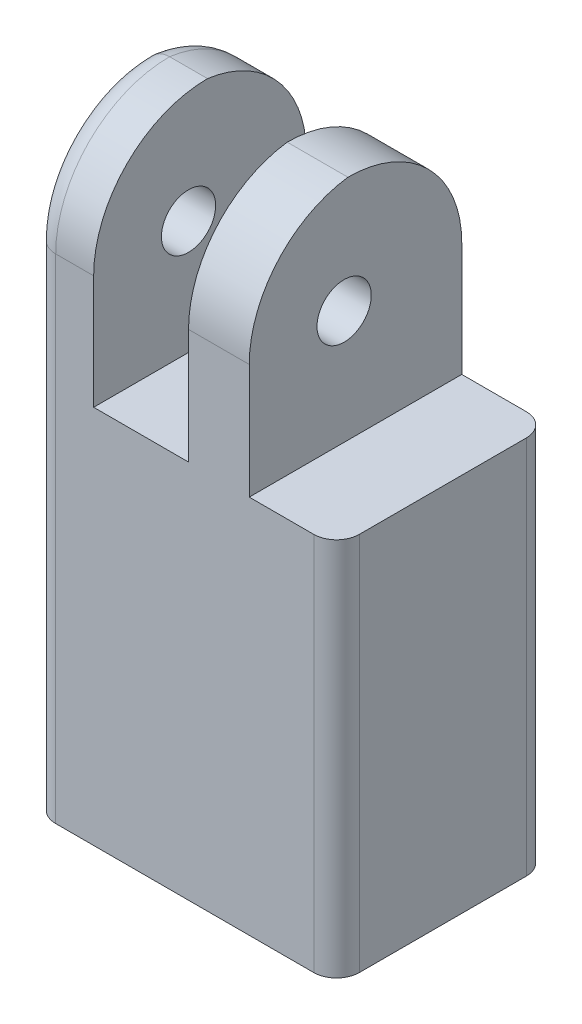
ISO-10303-21;
HEADER;
FILE_DESCRIPTION(('STEP AP214'),'2;1');
FILE_NAME('part.step','',(''),(''),'','','');
FILE_SCHEMA(('AUTOMOTIVE_DESIGN { 1 0 10303 214 1 1 1 1 }'));
ENDSEC;
DATA;
#1=APPLICATION_CONTEXT('core data for automotive mechanical design processes');
#2=APPLICATION_PROTOCOL_DEFINITION('international standard','automotive_design',2000,#1);
#3=PRODUCT_CONTEXT('',#1,'mechanical');
#4=PRODUCT('Part','Part','',(#3));
#5=PRODUCT_RELATED_PRODUCT_CATEGORY('part','',(#4));
#6=PRODUCT_DEFINITION_FORMATION('','',#4);
#7=PRODUCT_DEFINITION_CONTEXT('part definition',#1,'design');
#8=PRODUCT_DEFINITION('design','',#6,#7);
#9=PRODUCT_DEFINITION_SHAPE('','',#8);
#10=(LENGTH_UNIT() NAMED_UNIT(*) SI_UNIT(.MILLI.,.METRE.));
#11=(NAMED_UNIT(*) PLANE_ANGLE_UNIT() SI_UNIT($,.RADIAN.));
#12=(NAMED_UNIT(*) SI_UNIT($,.STERADIAN.) SOLID_ANGLE_UNIT());
#13=UNCERTAINTY_MEASURE_WITH_UNIT(LENGTH_MEASURE(1.E-05),#10,'distance_accuracy_value','');
#14=(GEOMETRIC_REPRESENTATION_CONTEXT(3) GLOBAL_UNCERTAINTY_ASSIGNED_CONTEXT((#13)) GLOBAL_UNIT_ASSIGNED_CONTEXT((#10,
#11,#12)) REPRESENTATION_CONTEXT('',''));
#15=CARTESIAN_POINT('',(0.,0.,0.));
#16=DIRECTION('',(0.,0.,1.));
#17=DIRECTION('',(1.,0.,0.));
#18=AXIS2_PLACEMENT_3D('',#15,#16,#17);
#19=CARTESIAN_POINT('',(0.,50.,0.));
#20=DIRECTION('',(0.,-1.,0.));
#21=DIRECTION('',(0.,0.,-1.));
#22=AXIS2_PLACEMENT_3D('',#19,#20,#21);
#23=PLANE('',#22);
#24=DIRECTION('',(0.,0.,1.));
#25=VECTOR('',#24,1.);
#26=CARTESIAN_POINT('',(20.5,50.,-28.));
#27=LINE('',#26,#25);
#28=CARTESIAN_POINT('',(20.5,50.,-28.));
#29=VERTEX_POINT('',#28);
#30=CARTESIAN_POINT('',(20.5,50.,0.));
#31=VERTEX_POINT('',#30);
#32=EDGE_CURVE('E160',#29,#31,#27,.T.);
#33=ORIENTED_EDGE('',*,*,#32,.F.);
#34=DIRECTION('',(-1.,0.,0.));
#35=VECTOR('',#34,1.);
#36=CARTESIAN_POINT('',(0.,50.,-28.));
#37=LINE('',#36,#35);
#38=CARTESIAN_POINT('',(7.99999999999999,50.,-28.));
#39=VERTEX_POINT('',#38);
#40=EDGE_CURVE('E169',#29,#39,#37,.T.);
#41=ORIENTED_EDGE('',*,*,#40,.T.);
#42=DIRECTION('',(0.,0.,-1.));
#43=VECTOR('',#42,1.);
#44=CARTESIAN_POINT('',(7.99999999999999,50.,-28.));
#45=LINE('',#44,#43);
#46=CARTESIAN_POINT('',(7.99999999999999,50.,0.));
#47=VERTEX_POINT('',#46);
#48=EDGE_CURVE('E198',#47,#39,#45,.T.);
#49=ORIENTED_EDGE('',*,*,#48,.F.);
#50=DIRECTION('',(1.,0.,0.));
#51=VECTOR('',#50,1.);
#52=CARTESIAN_POINT('',(0.,50.,0.));
#53=LINE('',#52,#51);
#54=EDGE_CURVE('E182',#47,#31,#53,.T.);
#55=ORIENTED_EDGE('',*,*,#54,.T.);
#56=EDGE_LOOP('',(#33,#41,#49,#55));
#57=FACE_BOUND('',#56,.T.);
#58=ADVANCED_FACE('F37',(#57),#23,.F.);
#59=DIRECTION('',(0.,0.,-1.));
#60=VECTOR('',#59,1.);
#61=CARTESIAN_POINT('',(40.,50.,0.));
#62=LINE('',#61,#60);
#63=CARTESIAN_POINT('',(40.,50.,-3.));
#64=VERTEX_POINT('',#63);
#65=CARTESIAN_POINT('',(40.,50.,-25.));
#66=VERTEX_POINT('',#65);
#67=EDGE_CURVE('E178',#64,#66,#62,.T.);
#68=ORIENTED_EDGE('',*,*,#67,.T.);
#69=CARTESIAN_POINT('',(37.,50.,-25.));
#70=DIRECTION('',(0.,-1.,0.));
#71=DIRECTION('',(0.,0.,-1.));
#72=AXIS2_PLACEMENT_3D('',#69,#70,#71);
#73=CIRCLE('',#72,3.);
#74=CARTESIAN_POINT('',(37.,50.,-28.));
#75=VERTEX_POINT('',#74);
#76=EDGE_CURVE('E45',#66,#75,#73,.F.);
#77=ORIENTED_EDGE('',*,*,#76,.T.);
#78=CARTESIAN_POINT('',(28.5,50.,-28.));
#79=VERTEX_POINT('',#78);
#80=EDGE_CURVE('E177',#75,#79,#37,.T.);
#81=ORIENTED_EDGE('',*,*,#80,.T.);
#82=DIRECTION('',(0.,0.,-1.));
#83=VECTOR('',#82,1.);
#84=CARTESIAN_POINT('',(28.5,50.,-28.));
#85=LINE('',#84,#83);
#86=CARTESIAN_POINT('',(28.5,50.,0.));
#87=VERTEX_POINT('',#86);
#88=EDGE_CURVE('E166',#87,#79,#85,.T.);
#89=ORIENTED_EDGE('',*,*,#88,.F.);
#90=CARTESIAN_POINT('',(37.,50.,0.));
#91=VERTEX_POINT('',#90);
#92=EDGE_CURVE('E205',#87,#91,#53,.T.);
#93=ORIENTED_EDGE('',*,*,#92,.T.);
#94=CARTESIAN_POINT('',(37.,50.,-3.));
#95=DIRECTION('',(0.,-1.,0.));
#96=DIRECTION('',(0.,0.,-1.));
#97=AXIS2_PLACEMENT_3D('',#94,#95,#96);
#98=CIRCLE('',#97,3.);
#99=EDGE_CURVE('E380',#91,#64,#98,.F.);
#100=ORIENTED_EDGE('',*,*,#99,.T.);
#101=EDGE_LOOP('',(#68,#77,#81,#89,#93,#100));
#102=FACE_BOUND('',#101,.T.);
#103=ADVANCED_FACE('F306',(#102),#23,.F.);
#104=CARTESIAN_POINT('',(0.,50.,0.));
#105=DIRECTION('',(1.,0.,0.));
#106=DIRECTION('',(0.,0.,-1.));
#107=AXIS2_PLACEMENT_3D('',#104,#105,#106);
#108=PLANE('',#107);
#109=CARTESIAN_POINT('',(0.,65.,-12.5));
#110=DIRECTION('',(-1.,0.,0.));
#111=DIRECTION('',(0.,0.,1.));
#112=AXIS2_PLACEMENT_3D('',#109,#110,#111);
#113=CIRCLE('',#112,4.206875);
#114=CARTESIAN_POINT('',(0.,65.,-8.293125));
#115=VERTEX_POINT('',#114);
#116=EDGE_CURVE('E359',#115,#115,#113,.T.);
#117=ORIENTED_EDGE('',*,*,#116,.F.);
#118=EDGE_LOOP('',(#117));
#119=FACE_BOUND('',#118,.T.);
#120=DIRECTION('',(0.,0.,1.));
#121=VECTOR('',#120,1.);
#122=CARTESIAN_POINT('',(0.,0.,0.));
#123=LINE('',#122,#121);
#124=CARTESIAN_POINT('',(0.,0.,-25.));
#125=VERTEX_POINT('',#124);
#126=CARTESIAN_POINT('',(0.,0.,-3.));
#127=VERTEX_POINT('',#126);
#128=EDGE_CURVE('E203',#125,#127,#123,.T.);
#129=ORIENTED_EDGE('',*,*,#128,.T.);
#130=DIRECTION('',(0.,-1.,0.));
#131=VECTOR('',#130,1.);
#132=CARTESIAN_POINT('',(0.,50.,-3.));
#133=LINE('',#132,#131);
#134=CARTESIAN_POINT('',(0.,65.,-3.));
#135=VERTEX_POINT('',#134);
#136=EDGE_CURVE('E253',#127,#135,#133,.F.);
#137=ORIENTED_EDGE('',*,*,#136,.T.);
#138=CARTESIAN_POINT('',(0.,65.,-15.));
#139=DIRECTION('',(1.,0.,0.));
#140=DIRECTION('',(0.,0.,-1.));
#141=AXIS2_PLACEMENT_3D('',#138,#139,#140);
#142=CIRCLE('',#141,12.);
#143=CARTESIAN_POINT('',(0.,76.9983163456486,-14.7989903740096));
#144=VERTEX_POINT('',#143);
#145=EDGE_CURVE('E250',#135,#144,#142,.F.);
#146=ORIENTED_EDGE('',*,*,#145,.T.);
#147=CARTESIAN_POINT('',(0.,65.1339312526815,-13.));
#148=DIRECTION('',(1.,0.,0.));
#149=DIRECTION('',(0.,0.,-1.));
#150=AXIS2_PLACEMENT_3D('',#147,#148,#149);
#151=CIRCLE('',#150,12.);
#152=CARTESIAN_POINT('',(0.,65.1339312526815,-25.));
#153=VERTEX_POINT('',#152);
#154=EDGE_CURVE('E248',#144,#153,#151,.F.);
#155=ORIENTED_EDGE('',*,*,#154,.T.);
#156=DIRECTION('',(0.,-1.,0.));
#157=VECTOR('',#156,1.);
#158=CARTESIAN_POINT('',(0.,50.,-25.));
#159=LINE('',#158,#157);
#160=EDGE_CURVE('E246',#153,#125,#159,.T.);
#161=ORIENTED_EDGE('',*,*,#160,.T.);
#162=EDGE_LOOP('',(#129,#137,#146,#155,#161));
#163=FACE_BOUND('',#162,.T.);
#164=ADVANCED_FACE('F311',(#119,#163),#108,.F.);
#165=CARTESIAN_POINT('',(0.,50.,0.));
#166=DIRECTION('',(0.,0.,-1.));
#167=DIRECTION('',(-1.,0.,0.));
#168=AXIS2_PLACEMENT_3D('',#165,#166,#167);
#169=PLANE('',#168);
#170=DIRECTION('',(1.,0.,0.));
#171=VECTOR('',#170,1.);
#172=CARTESIAN_POINT('',(0.,0.,0.));
#173=LINE('',#172,#171);
#174=CARTESIAN_POINT('',(3.,0.,0.));
#175=VERTEX_POINT('',#174);
#176=CARTESIAN_POINT('',(37.,0.,0.));
#177=VERTEX_POINT('',#176);
#178=EDGE_CURVE('E210',#175,#177,#173,.T.);
#179=ORIENTED_EDGE('',*,*,#178,.T.);
#180=DIRECTION('',(0.,-1.,0.));
#181=VECTOR('',#180,1.);
#182=CARTESIAN_POINT('',(37.,50.,0.));
#183=LINE('',#182,#181);
#184=EDGE_CURVE('E11',#177,#91,#183,.F.);
#185=ORIENTED_EDGE('',*,*,#184,.T.);
#186=ORIENTED_EDGE('',*,*,#92,.F.);
#187=DIRECTION('',(0.,-1.,0.));
#188=VECTOR('',#187,1.);
#189=CARTESIAN_POINT('',(28.5,80.,0.));
#190=LINE('',#189,#188);
#191=CARTESIAN_POINT('',(28.5,65.1339312526815,0.));
#192=VERTEX_POINT('',#191);
#193=EDGE_CURVE('E194',#192,#87,#190,.T.);
#194=ORIENTED_EDGE('',*,*,#193,.F.);
#195=DIRECTION('',(-1.,0.,0.));
#196=VECTOR('',#195,1.);
#197=CARTESIAN_POINT('',(0.,65.1339312526815,0.));
#198=LINE('',#197,#196);
#199=CARTESIAN_POINT('',(20.5,65.1339312526815,0.));
#200=VERTEX_POINT('',#199);
#201=EDGE_CURVE('E237',#192,#200,#198,.T.);
#202=ORIENTED_EDGE('',*,*,#201,.T.);
#203=DIRECTION('',(0.,-1.,0.));
#204=VECTOR('',#203,1.);
#205=CARTESIAN_POINT('',(20.5,80.,0.));
#206=LINE('',#205,#204);
#207=EDGE_CURVE('E196',#200,#31,#206,.T.);
#208=ORIENTED_EDGE('',*,*,#207,.T.);
#209=ORIENTED_EDGE('',*,*,#54,.F.);
#210=DIRECTION('',(0.,-1.,0.));
#211=VECTOR('',#210,1.);
#212=CARTESIAN_POINT('',(8.,80.,0.));
#213=LINE('',#212,#211);
#214=CARTESIAN_POINT('',(8.,65.,0.));
#215=VERTEX_POINT('',#214);
#216=EDGE_CURVE('E201',#215,#47,#213,.T.);
#217=ORIENTED_EDGE('',*,*,#216,.F.);
#218=DIRECTION('',(1.,0.,0.));
#219=VECTOR('',#218,1.);
#220=CARTESIAN_POINT('',(0.,65.,0.));
#221=LINE('',#220,#219);
#222=CARTESIAN_POINT('',(3.,65.,0.));
#223=VERTEX_POINT('',#222);
#224=EDGE_CURVE('E223',#215,#223,#221,.F.);
#225=ORIENTED_EDGE('',*,*,#224,.T.);
#226=DIRECTION('',(0.,-1.,0.));
#227=VECTOR('',#226,1.);
#228=CARTESIAN_POINT('',(3.,50.,0.));
#229=LINE('',#228,#227);
#230=EDGE_CURVE('E259',#223,#175,#229,.T.);
#231=ORIENTED_EDGE('',*,*,#230,.T.);
#232=EDGE_LOOP('',(#179,#185,#186,#194,#202,#208,#209,#217,#225,#231));
#233=FACE_BOUND('',#232,.T.);
#234=ADVANCED_FACE('F326',(#233),#169,.F.);
#235=CARTESIAN_POINT('',(40.,50.,0.));
#236=DIRECTION('',(-1.,0.,0.));
#237=DIRECTION('',(0.,0.,1.));
#238=AXIS2_PLACEMENT_3D('',#235,#236,#237);
#239=PLANE('',#238);
#240=DIRECTION('',(0.,0.,-1.));
#241=VECTOR('',#240,1.);
#242=CARTESIAN_POINT('',(40.,0.,0.));
#243=LINE('',#242,#241);
#244=CARTESIAN_POINT('',(40.,0.,-3.));
#245=VERTEX_POINT('',#244);
#246=CARTESIAN_POINT('',(40.,0.,-25.));
#247=VERTEX_POINT('',#246);
#248=EDGE_CURVE('E212',#245,#247,#243,.T.);
#249=ORIENTED_EDGE('',*,*,#248,.T.);
#250=DIRECTION('',(0.,-1.,0.));
#251=VECTOR('',#250,1.);
#252=CARTESIAN_POINT('',(40.,50.,-25.));
#253=LINE('',#252,#251);
#254=EDGE_CURVE('E58',#247,#66,#253,.F.);
#255=ORIENTED_EDGE('',*,*,#254,.T.);
#256=ORIENTED_EDGE('',*,*,#67,.F.);
#257=DIRECTION('',(0.,-1.,0.));
#258=VECTOR('',#257,1.);
#259=CARTESIAN_POINT('',(40.,50.,-3.));
#260=LINE('',#259,#258);
#261=EDGE_CURVE('E381',#64,#245,#260,.T.);
#262=ORIENTED_EDGE('',*,*,#261,.T.);
#263=EDGE_LOOP('',(#249,#255,#256,#262));
#264=FACE_BOUND('',#263,.T.);
#265=ADVANCED_FACE('F323',(#264),#239,.F.);
#266=CARTESIAN_POINT('',(0.,50.,-28.));
#267=DIRECTION('',(0.,0.,1.));
#268=DIRECTION('',(1.,0.,0.));
#269=AXIS2_PLACEMENT_3D('',#266,#267,#268);
#270=PLANE('',#269);
#271=ORIENTED_EDGE('',*,*,#80,.F.);
#272=DIRECTION('',(0.,-1.,0.));
#273=VECTOR('',#272,1.);
#274=CARTESIAN_POINT('',(37.,50.,-28.));
#275=LINE('',#274,#273);
#276=CARTESIAN_POINT('',(37.,0.,-28.));
#277=VERTEX_POINT('',#276);
#278=EDGE_CURVE('E268',#75,#277,#275,.T.);
#279=ORIENTED_EDGE('',*,*,#278,.T.);
#280=DIRECTION('',(-1.,0.,0.));
#281=VECTOR('',#280,1.);
#282=CARTESIAN_POINT('',(0.,0.,-28.));
#283=LINE('',#282,#281);
#284=CARTESIAN_POINT('',(2.99999999999999,0.,-28.));
#285=VERTEX_POINT('',#284);
#286=EDGE_CURVE('E214',#277,#285,#283,.T.);
#287=ORIENTED_EDGE('',*,*,#286,.T.);
#288=DIRECTION('',(0.,-1.,0.));
#289=VECTOR('',#288,1.);
#290=CARTESIAN_POINT('',(2.99999999999999,50.,-28.));
#291=LINE('',#290,#289);
#292=CARTESIAN_POINT('',(2.99999999999999,65.1339312526815,-28.));
#293=VERTEX_POINT('',#292);
#294=EDGE_CURVE('E266',#285,#293,#291,.F.);
#295=ORIENTED_EDGE('',*,*,#294,.T.);
#296=DIRECTION('',(1.,0.,0.));
#297=VECTOR('',#296,1.);
#298=CARTESIAN_POINT('',(0.,65.1339312526815,-28.));
#299=LINE('',#298,#297);
#300=CARTESIAN_POINT('',(7.99999999999999,65.1339312526815,-28.));
#301=VERTEX_POINT('',#300);
#302=EDGE_CURVE('E241',#293,#301,#299,.T.);
#303=ORIENTED_EDGE('',*,*,#302,.T.);
#304=DIRECTION('',(0.,-1.,0.));
#305=VECTOR('',#304,1.);
#306=CARTESIAN_POINT('',(7.99999999999999,80.,-28.));
#307=LINE('',#306,#305);
#308=EDGE_CURVE('E173',#301,#39,#307,.T.);
#309=ORIENTED_EDGE('',*,*,#308,.T.);
#310=ORIENTED_EDGE('',*,*,#40,.F.);
#311=DIRECTION('',(0.,-1.,0.));
#312=VECTOR('',#311,1.);
#313=CARTESIAN_POINT('',(20.5,80.,-28.));
#314=LINE('',#313,#312);
#315=CARTESIAN_POINT('',(20.5,65.,-28.));
#316=VERTEX_POINT('',#315);
#317=EDGE_CURVE('E155',#316,#29,#314,.T.);
#318=ORIENTED_EDGE('',*,*,#317,.F.);
#319=DIRECTION('',(-1.,0.,0.));
#320=VECTOR('',#319,1.);
#321=CARTESIAN_POINT('',(28.5,65.,-28.));
#322=LINE('',#321,#320);
#323=CARTESIAN_POINT('',(28.5,65.,-28.));
#324=VERTEX_POINT('',#323);
#325=EDGE_CURVE('E230',#316,#324,#322,.F.);
#326=ORIENTED_EDGE('',*,*,#325,.T.);
#327=DIRECTION('',(0.,-1.,0.));
#328=VECTOR('',#327,1.);
#329=CARTESIAN_POINT('',(28.5,80.,-28.));
#330=LINE('',#329,#328);
#331=EDGE_CURVE('E165',#324,#79,#330,.T.);
#332=ORIENTED_EDGE('',*,*,#331,.T.);
#333=EDGE_LOOP('',(#271,#279,#287,#295,#303,#309,#310,#318,#326,#332));
#334=FACE_BOUND('',#333,.T.);
#335=ADVANCED_FACE('F171',(#334),#270,.F.);
#336=CARTESIAN_POINT('',(0.,0.,0.));
#337=DIRECTION('',(0.,-1.,0.));
#338=DIRECTION('',(0.,0.,-1.));
#339=AXIS2_PLACEMENT_3D('',#336,#337,#338);
#340=PLANE('',#339);
#341=ORIENTED_EDGE('',*,*,#286,.F.);
#342=CARTESIAN_POINT('',(37.,0.,-25.));
#343=DIRECTION('',(0.,-1.,0.));
#344=DIRECTION('',(0.,0.,-1.));
#345=AXIS2_PLACEMENT_3D('',#342,#343,#344);
#346=CIRCLE('',#345,3.);
#347=EDGE_CURVE('E386',#277,#247,#346,.T.);
#348=ORIENTED_EDGE('',*,*,#347,.T.);
#349=ORIENTED_EDGE('',*,*,#248,.F.);
#350=CARTESIAN_POINT('',(37.,0.,-3.));
#351=DIRECTION('',(0.,-1.,0.));
#352=DIRECTION('',(0.,0.,-1.));
#353=AXIS2_PLACEMENT_3D('',#350,#351,#352);
#354=CIRCLE('',#353,3.);
#355=EDGE_CURVE('E376',#245,#177,#354,.T.);
#356=ORIENTED_EDGE('',*,*,#355,.T.);
#357=ORIENTED_EDGE('',*,*,#178,.F.);
#358=CARTESIAN_POINT('',(3.,0.,-3.));
#359=DIRECTION('',(0.,-1.,0.));
#360=DIRECTION('',(0.,0.,-1.));
#361=AXIS2_PLACEMENT_3D('',#358,#359,#360);
#362=CIRCLE('',#361,3.);
#363=EDGE_CURVE('E264',#175,#127,#362,.T.);
#364=ORIENTED_EDGE('',*,*,#363,.T.);
#365=ORIENTED_EDGE('',*,*,#128,.F.);
#366=CARTESIAN_POINT('',(2.99999999999999,0.,-25.));
#367=DIRECTION('',(0.,-1.,0.));
#368=DIRECTION('',(0.,0.,-1.));
#369=AXIS2_PLACEMENT_3D('',#366,#367,#368);
#370=CIRCLE('',#369,3.);
#371=EDGE_CURVE('E261',#125,#285,#370,.T.);
#372=ORIENTED_EDGE('',*,*,#371,.T.);
#373=EDGE_LOOP('',(#341,#348,#349,#356,#357,#364,#365,#372));
#374=FACE_BOUND('',#373,.T.);
#375=ADVANCED_FACE('F317',(#374),#340,.T.);
#376=CARTESIAN_POINT('',(7.99999999999999,80.,-28.));
#377=DIRECTION('',(-1.,0.,0.));
#378=DIRECTION('',(0.,0.,1.));
#379=AXIS2_PLACEMENT_3D('',#376,#377,#378);
#380=PLANE('',#379);
#381=CARTESIAN_POINT('',(7.99999999999999,65.,-12.5));
#382=DIRECTION('',(-1.,0.,0.));
#383=DIRECTION('',(0.,0.,1.));
#384=AXIS2_PLACEMENT_3D('',#381,#382,#383);
#385=CIRCLE('',#384,3.571875);
#386=CARTESIAN_POINT('',(7.99999999999999,65.,-8.928125));
#387=VERTEX_POINT('',#386);
#388=EDGE_CURVE('E188',#387,#387,#385,.T.);
#389=ORIENTED_EDGE('',*,*,#388,.T.);
#390=EDGE_LOOP('',(#389));
#391=FACE_BOUND('',#390,.T.);
#392=ORIENTED_EDGE('',*,*,#308,.F.);
#393=CARTESIAN_POINT('',(7.99999999999999,65.1339312526815,-13.));
#394=DIRECTION('',(-1.,0.,0.));
#395=DIRECTION('',(0.,0.,1.));
#396=AXIS2_PLACEMENT_3D('',#393,#394,#395);
#397=CIRCLE('',#396,15.);
#398=CARTESIAN_POINT('',(7.99999999999999,80.,-15.));
#399=VERTEX_POINT('',#398);
#400=EDGE_CURVE('E243',#301,#399,#397,.F.);
#401=ORIENTED_EDGE('',*,*,#400,.T.);
#402=CARTESIAN_POINT('',(7.99999999999999,65.,-15.));
#403=DIRECTION('',(-1.,0.,0.));
#404=DIRECTION('',(0.,0.,1.));
#405=AXIS2_PLACEMENT_3D('',#402,#403,#404);
#406=CIRCLE('',#405,15.);
#407=EDGE_CURVE('E221',#399,#215,#406,.F.);
#408=ORIENTED_EDGE('',*,*,#407,.T.);
#409=ORIENTED_EDGE('',*,*,#216,.T.);
#410=ORIENTED_EDGE('',*,*,#48,.T.);
#411=EDGE_LOOP('',(#392,#401,#408,#409,#410));
#412=FACE_BOUND('',#411,.T.);
#413=ADVANCED_FACE('F315',(#391,#412),#380,.F.);
#414=CARTESIAN_POINT('',(20.5,80.,-28.));
#415=DIRECTION('',(1.,0.,0.));
#416=DIRECTION('',(0.,0.,-1.));
#417=AXIS2_PLACEMENT_3D('',#414,#415,#416);
#418=PLANE('',#417);
#419=CARTESIAN_POINT('',(20.5,65.,-12.5));
#420=DIRECTION('',(1.,0.,0.));
#421=DIRECTION('',(0.,0.,-1.));
#422=AXIS2_PLACEMENT_3D('',#419,#420,#421);
#423=CIRCLE('',#422,3.571875);
#424=CARTESIAN_POINT('',(20.5,65.,-16.071875));
#425=VERTEX_POINT('',#424);
#426=EDGE_CURVE('E183',#425,#425,#423,.T.);
#427=ORIENTED_EDGE('',*,*,#426,.T.);
#428=EDGE_LOOP('',(#427));
#429=FACE_BOUND('',#428,.T.);
#430=ORIENTED_EDGE('',*,*,#207,.F.);
#431=CARTESIAN_POINT('',(20.5,65.1339312526815,-15.));
#432=DIRECTION('',(1.,0.,0.));
#433=DIRECTION('',(0.,0.,-1.));
#434=AXIS2_PLACEMENT_3D('',#431,#432,#433);
#435=CIRCLE('',#434,15.);
#436=CARTESIAN_POINT('',(20.5,80.,-13.));
#437=VERTEX_POINT('',#436);
#438=EDGE_CURVE('E239',#200,#437,#435,.F.);
#439=ORIENTED_EDGE('',*,*,#438,.T.);
#440=CARTESIAN_POINT('',(20.5,65.,-13.));
#441=DIRECTION('',(1.,0.,0.));
#442=DIRECTION('',(0.,0.,-1.));
#443=AXIS2_PLACEMENT_3D('',#440,#441,#442);
#444=CIRCLE('',#443,15.);
#445=EDGE_CURVE('E162',#437,#316,#444,.F.);
#446=ORIENTED_EDGE('',*,*,#445,.T.);
#447=ORIENTED_EDGE('',*,*,#317,.T.);
#448=ORIENTED_EDGE('',*,*,#32,.T.);
#449=EDGE_LOOP('',(#430,#439,#446,#447,#448));
#450=FACE_BOUND('',#449,.T.);
#451=ADVANCED_FACE('F158',(#429,#450),#418,.F.);
#452=CARTESIAN_POINT('',(28.5,80.,-28.));
#453=DIRECTION('',(-1.,0.,0.));
#454=DIRECTION('',(0.,0.,1.));
#455=AXIS2_PLACEMENT_3D('',#452,#453,#454);
#456=PLANE('',#455);
#457=CARTESIAN_POINT('',(28.5,65.,-12.5));
#458=DIRECTION('',(-1.,0.,0.));
#459=DIRECTION('',(0.,0.,1.));
#460=AXIS2_PLACEMENT_3D('',#457,#458,#459);
#461=CIRCLE('',#460,3.571875);
#462=CARTESIAN_POINT('',(28.5,65.,-8.928125));
#463=VERTEX_POINT('',#462);
#464=EDGE_CURVE('E216',#463,#463,#461,.T.);
#465=ORIENTED_EDGE('',*,*,#464,.T.);
#466=EDGE_LOOP('',(#465));
#467=FACE_BOUND('',#466,.T.);
#468=CARTESIAN_POINT('',(28.5,65.,-13.));
#469=DIRECTION('',(-1.,0.,0.));
#470=DIRECTION('',(0.,0.,1.));
#471=AXIS2_PLACEMENT_3D('',#468,#469,#470);
#472=CIRCLE('',#471,15.);
#473=CARTESIAN_POINT('',(28.5,80.,-13.));
#474=VERTEX_POINT('',#473);
#475=EDGE_CURVE('E232',#324,#474,#472,.F.);
#476=ORIENTED_EDGE('',*,*,#475,.T.);
#477=CARTESIAN_POINT('',(28.5,65.1339312526815,-15.));
#478=DIRECTION('',(-1.,0.,0.));
#479=DIRECTION('',(0.,0.,1.));
#480=AXIS2_PLACEMENT_3D('',#477,#478,#479);
#481=CIRCLE('',#480,15.);
#482=EDGE_CURVE('E235',#474,#192,#481,.F.);
#483=ORIENTED_EDGE('',*,*,#482,.T.);
#484=ORIENTED_EDGE('',*,*,#193,.T.);
#485=ORIENTED_EDGE('',*,*,#88,.T.);
#486=ORIENTED_EDGE('',*,*,#331,.F.);
#487=EDGE_LOOP('',(#476,#483,#484,#485,#486));
#488=FACE_BOUND('',#487,.T.);
#489=ADVANCED_FACE('F395',(#467,#488),#456,.F.);
#490=CARTESIAN_POINT('',(0.,65.,-12.5));
#491=DIRECTION('',(-1.,0.,0.));
#492=DIRECTION('',(0.,0.,1.));
#493=AXIS2_PLACEMENT_3D('',#490,#491,#492);
#494=CYLINDRICAL_SURFACE('',#493,3.571875);
#495=ORIENTED_EDGE('',*,*,#464,.F.);
#496=EDGE_LOOP('',(#495));
#497=FACE_BOUND('',#496,.T.);
#498=ORIENTED_EDGE('',*,*,#426,.F.);
#499=EDGE_LOOP('',(#498));
#500=FACE_BOUND('',#499,.T.);
#501=ADVANCED_FACE('F401',(#497,#500),#494,.F.);
#502=CARTESIAN_POINT('',(0.634999999999998,65.,-12.5));
#503=DIRECTION('',(-1.,0.,0.));
#504=DIRECTION('',(0.,0.,1.));
#505=AXIS2_PLACEMENT_3D('',#502,#503,#504);
#506=CIRCLE('',#505,3.571875);
#507=CARTESIAN_POINT('',(0.634999999999999,65.,-8.928125));
#508=VERTEX_POINT('',#507);
#509=EDGE_CURVE('E219',#508,#508,#506,.T.);
#510=ORIENTED_EDGE('',*,*,#509,.T.);
#511=EDGE_LOOP('',(#510));
#512=FACE_BOUND('',#511,.T.);
#513=ORIENTED_EDGE('',*,*,#388,.F.);
#514=EDGE_LOOP('',(#513));
#515=FACE_BOUND('',#514,.T.);
#516=ADVANCED_FACE('F408',(#512,#515),#494,.F.);
#517=CARTESIAN_POINT('',(0.,65.,-12.5));
#518=DIRECTION('',(-1.,0.,0.));
#519=DIRECTION('',(0.,0.,1.));
#520=AXIS2_PLACEMENT_3D('',#517,#518,#519);
#521=CONICAL_SURFACE('',#520,4.206875,0.785398163397447);
#522=ORIENTED_EDGE('',*,*,#509,.F.);
#523=EDGE_LOOP('',(#522));
#524=FACE_BOUND('',#523,.T.);
#525=ORIENTED_EDGE('',*,*,#116,.T.);
#526=EDGE_LOOP('',(#525));
#527=FACE_BOUND('',#526,.T.);
#528=ADVANCED_FACE('F336',(#524,#527),#521,.F.);
#529=CARTESIAN_POINT('',(0.,65.,-15.));
#530=DIRECTION('',(-1.,0.,0.));
#531=DIRECTION('',(0.,0.,1.));
#532=AXIS2_PLACEMENT_3D('',#529,#530,#531);
#533=CYLINDRICAL_SURFACE('',#532,15.);
#534=DIRECTION('',(1.,0.,0.));
#535=VECTOR('',#534,1.);
#536=CARTESIAN_POINT('',(8.,80.,-15.));
#537=LINE('',#536,#535);
#538=CARTESIAN_POINT('',(3.,80.,-15.));
#539=VERTEX_POINT('',#538);
#540=EDGE_CURVE('E207',#539,#399,#537,.T.);
#541=ORIENTED_EDGE('',*,*,#540,.F.);
#542=CARTESIAN_POINT('',(3.,65.,-15.));
#543=DIRECTION('',(1.,0.,0.));
#544=DIRECTION('',(0.,0.,-1.));
#545=AXIS2_PLACEMENT_3D('',#542,#543,#544);
#546=CIRCLE('',#545,15.);
#547=EDGE_CURVE('E255',#539,#223,#546,.T.);
#548=ORIENTED_EDGE('',*,*,#547,.T.);
#549=ORIENTED_EDGE('',*,*,#224,.F.);
#550=ORIENTED_EDGE('',*,*,#407,.F.);
#551=EDGE_LOOP('',(#541,#548,#549,#550));
#552=FACE_BOUND('',#551,.T.);
#553=ADVANCED_FACE('F332',(#552),#533,.T.);
#554=CARTESIAN_POINT('',(0.,65.,-13.));
#555=DIRECTION('',(1.,0.,0.));
#556=DIRECTION('',(0.,0.,-1.));
#557=AXIS2_PLACEMENT_3D('',#554,#555,#556);
#558=CYLINDRICAL_SURFACE('',#557,15.);
#559=ORIENTED_EDGE('',*,*,#475,.F.);
#560=ORIENTED_EDGE('',*,*,#325,.F.);
#561=ORIENTED_EDGE('',*,*,#445,.F.);
#562=DIRECTION('',(-1.,0.,0.));
#563=VECTOR('',#562,1.);
#564=CARTESIAN_POINT('',(20.5,80.,-13.));
#565=LINE('',#564,#563);
#566=EDGE_CURVE('E226',#474,#437,#565,.T.);
#567=ORIENTED_EDGE('',*,*,#566,.F.);
#568=EDGE_LOOP('',(#559,#560,#561,#567));
#569=FACE_BOUND('',#568,.T.);
#570=ADVANCED_FACE('F335',(#569),#558,.T.);
#571=CARTESIAN_POINT('',(0.,65.1339312526815,-15.));
#572=DIRECTION('',(-1.,0.,0.));
#573=DIRECTION('',(0.,0.,1.));
#574=AXIS2_PLACEMENT_3D('',#571,#572,#573);
#575=CYLINDRICAL_SURFACE('',#574,15.);
#576=ORIENTED_EDGE('',*,*,#438,.F.);
#577=ORIENTED_EDGE('',*,*,#201,.F.);
#578=ORIENTED_EDGE('',*,*,#482,.F.);
#579=ORIENTED_EDGE('',*,*,#566,.T.);
#580=EDGE_LOOP('',(#576,#577,#578,#579));
#581=FACE_BOUND('',#580,.T.);
#582=ADVANCED_FACE('F340',(#581),#575,.T.);
#583=CARTESIAN_POINT('',(0.,65.1339312526815,-13.));
#584=DIRECTION('',(1.,0.,0.));
#585=DIRECTION('',(0.,0.,-1.));
#586=AXIS2_PLACEMENT_3D('',#583,#584,#585);
#587=CYLINDRICAL_SURFACE('',#586,15.);
#588=ORIENTED_EDGE('',*,*,#302,.F.);
#589=CARTESIAN_POINT('',(3.,65.1339312526815,-13.));
#590=DIRECTION('',(1.,0.,0.));
#591=DIRECTION('',(0.,0.,-1.));
#592=AXIS2_PLACEMENT_3D('',#589,#590,#591);
#593=CIRCLE('',#592,15.);
#594=EDGE_CURVE('E257',#293,#539,#593,.T.);
#595=ORIENTED_EDGE('',*,*,#594,.T.);
#596=ORIENTED_EDGE('',*,*,#540,.T.);
#597=ORIENTED_EDGE('',*,*,#400,.F.);
#598=EDGE_LOOP('',(#588,#595,#596,#597));
#599=FACE_BOUND('',#598,.T.);
#600=ADVANCED_FACE('F293',(#599),#587,.T.);
#601=CARTESIAN_POINT('',(2.99999999999999,50.,-25.));
#602=DIRECTION('',(0.,-1.,0.));
#603=DIRECTION('',(0.,0.,-1.));
#604=AXIS2_PLACEMENT_3D('',#601,#602,#603);
#605=CYLINDRICAL_SURFACE('',#604,3.);
#606=ORIENTED_EDGE('',*,*,#371,.F.);
#607=ORIENTED_EDGE('',*,*,#160,.F.);
#608=CARTESIAN_POINT('',(2.99999999999999,65.1339312526815,-25.));
#609=DIRECTION('',(0.,1.,0.));
#610=DIRECTION('',(0.,0.,1.));
#611=AXIS2_PLACEMENT_3D('',#608,#609,#610);
#612=CIRCLE('',#611,3.);
#613=EDGE_CURVE('E356',#293,#153,#612,.T.);
#614=ORIENTED_EDGE('',*,*,#613,.F.);
#615=ORIENTED_EDGE('',*,*,#294,.F.);
#616=EDGE_LOOP('',(#606,#607,#614,#615));
#617=FACE_BOUND('',#616,.T.);
#618=ADVANCED_FACE('F290',(#617),#605,.T.);
#619=CARTESIAN_POINT('',(3.,50.,-3.));
#620=DIRECTION('',(0.,-1.,0.));
#621=DIRECTION('',(0.,0.,-1.));
#622=AXIS2_PLACEMENT_3D('',#619,#620,#621);
#623=CYLINDRICAL_SURFACE('',#622,3.);
#624=ORIENTED_EDGE('',*,*,#363,.F.);
#625=ORIENTED_EDGE('',*,*,#230,.F.);
#626=CARTESIAN_POINT('',(3.,65.,-3.));
#627=DIRECTION('',(0.,1.,0.));
#628=DIRECTION('',(0.,0.,1.));
#629=AXIS2_PLACEMENT_3D('',#626,#627,#628);
#630=CIRCLE('',#629,3.);
#631=EDGE_CURVE('E277',#135,#223,#630,.T.);
#632=ORIENTED_EDGE('',*,*,#631,.F.);
#633=ORIENTED_EDGE('',*,*,#136,.F.);
#634=EDGE_LOOP('',(#624,#625,#632,#633));
#635=FACE_BOUND('',#634,.T.);
#636=ADVANCED_FACE('F286',(#635),#623,.T.);
#637=CARTESIAN_POINT('',(3.,65.1339312526815,-13.));
#638=DIRECTION('',(1.,0.,0.));
#639=DIRECTION('',(0.,0.,-1.));
#640=AXIS2_PLACEMENT_3D('',#637,#638,#639);
#641=TOROIDAL_SURFACE('',#640,12.,3.);
#642=ORIENTED_EDGE('',*,*,#613,.T.);
#643=ORIENTED_EDGE('',*,*,#154,.F.);
#644=CARTESIAN_POINT('',(3.,80.,-15.));
#645=CARTESIAN_POINT('',(2.91576846279267,80.0000081586494,-15.000000546349));
#646=CARTESIAN_POINT('',(2.83154080527727,79.9964525580558,-14.9997624433283));
#647=CARTESIAN_POINT('',(2.66368895000304,79.9822769555375,-14.9988131652269));
#648=CARTESIAN_POINT('',(2.58006472139663,79.9716573173532,-14.9981020145043));
#649=CARTESIAN_POINT('',(2.41406848367359,79.9434272640329,-14.9962115713021));
#650=CARTESIAN_POINT('',(2.33169558808982,79.9258220627779,-14.9950326279732));
#651=CARTESIAN_POINT('',(2.16874932725593,79.8837650878308,-14.9922162563039));
#652=CARTESIAN_POINT('',(2.08817594131154,79.8593133929169,-14.9905788332389));
#653=CARTESIAN_POINT('',(1.84993582441899,79.7758900648642,-14.9849923378244));
#654=CARTESIAN_POINT('',(1.69567765928619,79.7068379651198,-14.9803682207149));
#655=CARTESIAN_POINT('',(1.40107684524169,79.5439442349253,-14.9694599400454));
#656=CARTESIAN_POINT('',(1.26073118104379,79.450107992222,-14.9631761372794));
#657=CARTESIAN_POINT('',(0.997652426125306,79.2402064168243,-14.9491199468129));
#658=CARTESIAN_POINT('',(0.874933813178192,79.1241229922526,-14.9413463475787));
#659=CARTESIAN_POINT('',(0.650688069344476,78.8730475280578,-14.9245329218601));
#660=CARTESIAN_POINT('',(0.549167660212557,78.7380495133987,-14.9154926952537));
#661=CARTESIAN_POINT('',(0.369981157322589,78.4526867871411,-14.8963832015556));
#662=CARTESIAN_POINT('',(0.292372696344415,78.3022860954184,-14.8863115250323));
#663=CARTESIAN_POINT('',(0.163542005133148,77.9906907497679,-14.8654453475459));
#664=CARTESIAN_POINT('',(0.112299769569472,77.8295043847054,-14.8546514016518));
#665=CARTESIAN_POINT('',(0.0510059930647796,77.5602464891308,-14.8366203780276));
#666=CARTESIAN_POINT('',(0.0327664202376321,77.4539488797901,-14.8295020920397));
#667=CARTESIAN_POINT('',(0.00781181557982113,77.2401242712679,-14.8151831932027));
#668=CARTESIAN_POINT('',(0.0010779475216756,77.1325995721244,-14.8079827343772));
#669=CARTESIAN_POINT('',(3.96772851113421E-05,77.0161758322696,-14.8001863457172));
#670=CARTESIAN_POINT('',(-1.03330655468394E-07,77.0072457715077,-14.799588338605));
#671=CARTESIAN_POINT('',(0.,76.9983163456486,-14.7989903740096));
#672=B_SPLINE_CURVE_WITH_KNOTS('',3,(#644,#645,#646,#647,#648,#649,#650,#651,#652,#653,#654,
#655,#656,#657,#658,#659,#660,#661,#662,#663,#664,#665,#666,#667,#668,#669,#670,#671),
.UNSPECIFIED.,.F.,.F.,(4,2,2,2,2,2,2,2,2,2,2,2,2,4),(0.,0.252612272345217,0.505211538219144,
0.757622622759409,1.01003080308818,1.51463235232179,2.01912429796984,2.52402826146362,
3.02909208302859,3.53536385938218,4.04125093429299,4.36497439494447,4.68816737161102,
4.71501740044393),.UNSPECIFIED.);
#673=EDGE_CURVE('E269',#539,#144,#672,.T.);
#674=ORIENTED_EDGE('',*,*,#673,.F.);
#675=ORIENTED_EDGE('',*,*,#594,.F.);
#676=EDGE_LOOP('',(#642,#643,#674,#675));
#677=FACE_BOUND('',#676,.T.);
#678=ADVANCED_FACE('F282',(#677),#641,.T.);
#679=CARTESIAN_POINT('',(3.,65.,-15.));
#680=DIRECTION('',(1.,0.,0.));
#681=DIRECTION('',(0.,0.,-1.));
#682=AXIS2_PLACEMENT_3D('',#679,#680,#681);
#683=TOROIDAL_SURFACE('',#682,12.,3.);
#684=ORIENTED_EDGE('',*,*,#631,.T.);
#685=ORIENTED_EDGE('',*,*,#547,.F.);
#686=ORIENTED_EDGE('',*,*,#673,.T.);
#687=ORIENTED_EDGE('',*,*,#145,.F.);
#688=EDGE_LOOP('',(#684,#685,#686,#687));
#689=FACE_BOUND('',#688,.T.);
#690=ADVANCED_FACE('F279',(#689),#683,.T.);
#691=CARTESIAN_POINT('',(37.,50.,-25.));
#692=DIRECTION('',(0.,-1.,0.));
#693=DIRECTION('',(0.,0.,-1.));
#694=AXIS2_PLACEMENT_3D('',#691,#692,#693);
#695=CYLINDRICAL_SURFACE('',#694,3.);
#696=ORIENTED_EDGE('',*,*,#76,.F.);
#697=ORIENTED_EDGE('',*,*,#254,.F.);
#698=ORIENTED_EDGE('',*,*,#347,.F.);
#699=ORIENTED_EDGE('',*,*,#278,.F.);
#700=EDGE_LOOP('',(#696,#697,#698,#699));
#701=FACE_BOUND('',#700,.T.);
#702=ADVANCED_FACE('F295',(#701),#695,.T.);
#703=CARTESIAN_POINT('',(37.,50.,-3.));
#704=DIRECTION('',(0.,-1.,0.));
#705=DIRECTION('',(0.,0.,-1.));
#706=AXIS2_PLACEMENT_3D('',#703,#704,#705);
#707=CYLINDRICAL_SURFACE('',#706,3.);
#708=ORIENTED_EDGE('',*,*,#99,.F.);
#709=ORIENTED_EDGE('',*,*,#184,.F.);
#710=ORIENTED_EDGE('',*,*,#355,.F.);
#711=ORIENTED_EDGE('',*,*,#261,.F.);
#712=EDGE_LOOP('',(#708,#709,#710,#711));
#713=FACE_BOUND('',#712,.T.);
#714=ADVANCED_FACE('F39',(#713),#707,.T.);
#715=CLOSED_SHELL('',(#58,#103,#164,#234,#265,#335,#375,#413,#451,#489,#501,#516,#528,#553,#570,
#582,#600,#618,#636,#678,#690,#702,#714));
#716=MANIFOLD_SOLID_BREP('B2',#715);
#717=ADVANCED_BREP_SHAPE_REPRESENTATION('',(#18,#716),#14);
#718=SHAPE_DEFINITION_REPRESENTATION(#9,#717);
ENDSEC;
END-ISO-10303-21;
